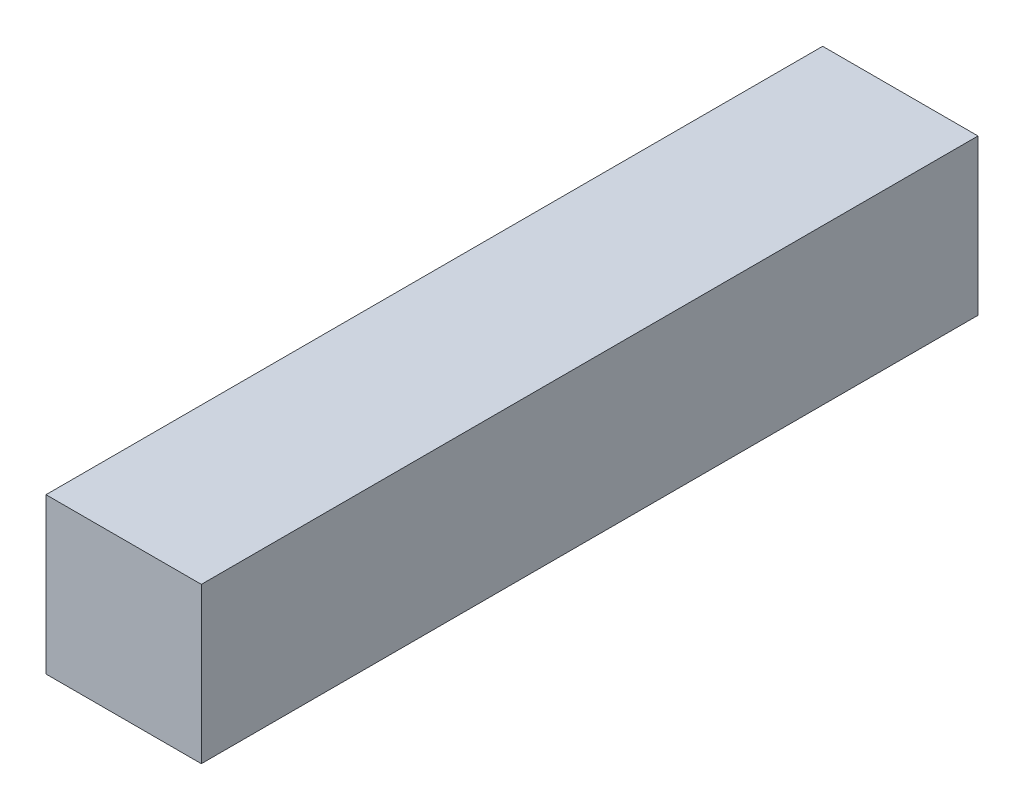
ISO-10303-21;
HEADER;
FILE_DESCRIPTION(('STEP AP214'),'2;1');
FILE_NAME('part.step','',(''),(''),'','','');
FILE_SCHEMA(('AUTOMOTIVE_DESIGN { 1 0 10303 214 1 1 1 1 }'));
ENDSEC;
DATA;
#1=APPLICATION_CONTEXT('core data for automotive mechanical design processes');
#2=APPLICATION_PROTOCOL_DEFINITION('international standard','automotive_design',2000,#1);
#3=PRODUCT_CONTEXT('',#1,'mechanical');
#4=PRODUCT('Part','Part','',(#3));
#5=PRODUCT_RELATED_PRODUCT_CATEGORY('part','',(#4));
#6=PRODUCT_DEFINITION_FORMATION('','',#4);
#7=PRODUCT_DEFINITION_CONTEXT('part definition',#1,'design');
#8=PRODUCT_DEFINITION('design','',#6,#7);
#9=PRODUCT_DEFINITION_SHAPE('','',#8);
#10=(LENGTH_UNIT() NAMED_UNIT(*) SI_UNIT(.MILLI.,.METRE.));
#11=(NAMED_UNIT(*) PLANE_ANGLE_UNIT() SI_UNIT($,.RADIAN.));
#12=(NAMED_UNIT(*) SI_UNIT($,.STERADIAN.) SOLID_ANGLE_UNIT());
#13=UNCERTAINTY_MEASURE_WITH_UNIT(LENGTH_MEASURE(1.E-05),#10,'distance_accuracy_value','');
#14=(GEOMETRIC_REPRESENTATION_CONTEXT(3) GLOBAL_UNCERTAINTY_ASSIGNED_CONTEXT((#13)) GLOBAL_UNIT_ASSIGNED_CONTEXT((#10,
#11,#12)) REPRESENTATION_CONTEXT('',''));
#15=CARTESIAN_POINT('',(0.,0.,0.));
#16=DIRECTION('',(0.,0.,1.));
#17=DIRECTION('',(1.,0.,0.));
#18=AXIS2_PLACEMENT_3D('',#15,#16,#17);
#19=CARTESIAN_POINT('',(0.,0.,15.));
#20=DIRECTION('',(1.,0.,0.));
#21=DIRECTION('',(0.,1.,0.));
#22=AXIS2_PLACEMENT_3D('',#19,#20,#21);
#23=PLANE('',#22);
#24=DIRECTION('',(0.,-1.,0.));
#25=VECTOR('',#24,1.);
#26=CARTESIAN_POINT('',(0.,0.,0.));
#27=LINE('',#26,#25);
#28=CARTESIAN_POINT('',(0.,3.,0.));
#29=VERTEX_POINT('',#28);
#30=CARTESIAN_POINT('',(0.,0.,0.));
#31=VERTEX_POINT('',#30);
#32=EDGE_CURVE('E114',#29,#31,#27,.T.);
#33=ORIENTED_EDGE('',*,*,#32,.T.);
#34=DIRECTION('',(0.,0.,-1.));
#35=VECTOR('',#34,1.);
#36=CARTESIAN_POINT('',(0.,0.,15.));
#37=LINE('',#36,#35);
#38=CARTESIAN_POINT('',(0.,0.,15.));
#39=VERTEX_POINT('',#38);
#40=EDGE_CURVE('E11',#39,#31,#37,.T.);
#41=ORIENTED_EDGE('',*,*,#40,.F.);
#42=DIRECTION('',(0.,-1.,0.));
#43=VECTOR('',#42,1.);
#44=CARTESIAN_POINT('',(0.,0.,15.));
#45=LINE('',#44,#43);
#46=CARTESIAN_POINT('',(0.,3.,15.));
#47=VERTEX_POINT('',#46);
#48=EDGE_CURVE('E98',#47,#39,#45,.T.);
#49=ORIENTED_EDGE('',*,*,#48,.F.);
#50=DIRECTION('',(0.,0.,-1.));
#51=VECTOR('',#50,1.);
#52=CARTESIAN_POINT('',(0.,3.,15.));
#53=LINE('',#52,#51);
#54=EDGE_CURVE('E110',#47,#29,#53,.T.);
#55=ORIENTED_EDGE('',*,*,#54,.T.);
#56=EDGE_LOOP('',(#33,#41,#49,#55));
#57=FACE_BOUND('',#56,.T.);
#58=ADVANCED_FACE('F46',(#57),#23,.F.);
#59=CARTESIAN_POINT('',(0.,0.,15.));
#60=DIRECTION('',(0.,1.,0.));
#61=DIRECTION('',(0.,0.,1.));
#62=AXIS2_PLACEMENT_3D('',#59,#60,#61);
#63=PLANE('',#62);
#64=DIRECTION('',(1.,0.,0.));
#65=VECTOR('',#64,1.);
#66=CARTESIAN_POINT('',(0.,0.,0.));
#67=LINE('',#66,#65);
#68=CARTESIAN_POINT('',(3.,0.,0.));
#69=VERTEX_POINT('',#68);
#70=EDGE_CURVE('E103',#31,#69,#67,.T.);
#71=ORIENTED_EDGE('',*,*,#70,.T.);
#72=DIRECTION('',(0.,0.,-1.));
#73=VECTOR('',#72,1.);
#74=CARTESIAN_POINT('',(3.,0.,15.));
#75=LINE('',#74,#73);
#76=CARTESIAN_POINT('',(3.,0.,15.));
#77=VERTEX_POINT('',#76);
#78=EDGE_CURVE('E55',#77,#69,#75,.T.);
#79=ORIENTED_EDGE('',*,*,#78,.F.);
#80=DIRECTION('',(1.,0.,0.));
#81=VECTOR('',#80,1.);
#82=CARTESIAN_POINT('',(0.,0.,15.));
#83=LINE('',#82,#81);
#84=EDGE_CURVE('E93',#39,#77,#83,.T.);
#85=ORIENTED_EDGE('',*,*,#84,.F.);
#86=ORIENTED_EDGE('',*,*,#40,.T.);
#87=EDGE_LOOP('',(#71,#79,#85,#86));
#88=FACE_BOUND('',#87,.T.);
#89=ADVANCED_FACE('F102',(#88),#63,.F.);
#90=CARTESIAN_POINT('',(3.,0.,15.));
#91=DIRECTION('',(-1.,0.,0.));
#92=DIRECTION('',(0.,-1.,0.));
#93=AXIS2_PLACEMENT_3D('',#90,#91,#92);
#94=PLANE('',#93);
#95=DIRECTION('',(0.,1.,0.));
#96=VECTOR('',#95,1.);
#97=CARTESIAN_POINT('',(3.,0.,0.));
#98=LINE('',#97,#96);
#99=CARTESIAN_POINT('',(3.,3.,0.));
#100=VERTEX_POINT('',#99);
#101=EDGE_CURVE('E80',#69,#100,#98,.T.);
#102=ORIENTED_EDGE('',*,*,#101,.T.);
#103=DIRECTION('',(0.,0.,-1.));
#104=VECTOR('',#103,1.);
#105=CARTESIAN_POINT('',(3.,3.,15.));
#106=LINE('',#105,#104);
#107=CARTESIAN_POINT('',(3.,3.,15.));
#108=VERTEX_POINT('',#107);
#109=EDGE_CURVE('E105',#108,#100,#106,.T.);
#110=ORIENTED_EDGE('',*,*,#109,.F.);
#111=DIRECTION('',(0.,1.,0.));
#112=VECTOR('',#111,1.);
#113=CARTESIAN_POINT('',(3.,0.,15.));
#114=LINE('',#113,#112);
#115=EDGE_CURVE('E96',#77,#108,#114,.T.);
#116=ORIENTED_EDGE('',*,*,#115,.F.);
#117=ORIENTED_EDGE('',*,*,#78,.T.);
#118=EDGE_LOOP('',(#102,#110,#116,#117));
#119=FACE_BOUND('',#118,.T.);
#120=ADVANCED_FACE('F106',(#119),#94,.F.);
#121=CARTESIAN_POINT('',(0.,3.,15.));
#122=DIRECTION('',(0.,-1.,0.));
#123=DIRECTION('',(0.,0.,-1.));
#124=AXIS2_PLACEMENT_3D('',#121,#122,#123);
#125=PLANE('',#124);
#126=DIRECTION('',(-1.,0.,0.));
#127=VECTOR('',#126,1.);
#128=CARTESIAN_POINT('',(0.,3.,0.));
#129=LINE('',#128,#127);
#130=EDGE_CURVE('E86',#100,#29,#129,.T.);
#131=ORIENTED_EDGE('',*,*,#130,.T.);
#132=ORIENTED_EDGE('',*,*,#54,.F.);
#133=DIRECTION('',(-1.,0.,0.));
#134=VECTOR('',#133,1.);
#135=CARTESIAN_POINT('',(0.,3.,15.));
#136=LINE('',#135,#134);
#137=EDGE_CURVE('E63',#108,#47,#136,.T.);
#138=ORIENTED_EDGE('',*,*,#137,.F.);
#139=ORIENTED_EDGE('',*,*,#109,.T.);
#140=EDGE_LOOP('',(#131,#132,#138,#139));
#141=FACE_BOUND('',#140,.T.);
#142=ADVANCED_FACE('F127',(#141),#125,.F.);
#143=CARTESIAN_POINT('',(0.,0.,15.));
#144=DIRECTION('',(0.,0.,-1.));
#145=DIRECTION('',(-1.,0.,0.));
#146=AXIS2_PLACEMENT_3D('',#143,#144,#145);
#147=PLANE('',#146);
#148=ORIENTED_EDGE('',*,*,#48,.T.);
#149=ORIENTED_EDGE('',*,*,#84,.T.);
#150=ORIENTED_EDGE('',*,*,#115,.T.);
#151=ORIENTED_EDGE('',*,*,#137,.T.);
#152=EDGE_LOOP('',(#148,#149,#150,#151));
#153=FACE_BOUND('',#152,.T.);
#154=ADVANCED_FACE('F94',(#153),#147,.F.);
#155=CARTESIAN_POINT('',(0.,0.,0.));
#156=DIRECTION('',(0.,0.,-1.));
#157=DIRECTION('',(-1.,0.,0.));
#158=AXIS2_PLACEMENT_3D('',#155,#156,#157);
#159=PLANE('',#158);
#160=ORIENTED_EDGE('',*,*,#32,.F.);
#161=ORIENTED_EDGE('',*,*,#130,.F.);
#162=ORIENTED_EDGE('',*,*,#101,.F.);
#163=ORIENTED_EDGE('',*,*,#70,.F.);
#164=EDGE_LOOP('',(#160,#161,#162,#163));
#165=FACE_BOUND('',#164,.T.);
#166=ADVANCED_FACE('F130',(#165),#159,.T.);
#167=CLOSED_SHELL('',(#58,#89,#120,#142,#154,#166));
#168=MANIFOLD_SOLID_BREP('B2',#167);
#169=ADVANCED_BREP_SHAPE_REPRESENTATION('',(#18,#168),#14);
#170=SHAPE_DEFINITION_REPRESENTATION(#9,#169);
ENDSEC;
END-ISO-10303-21;
